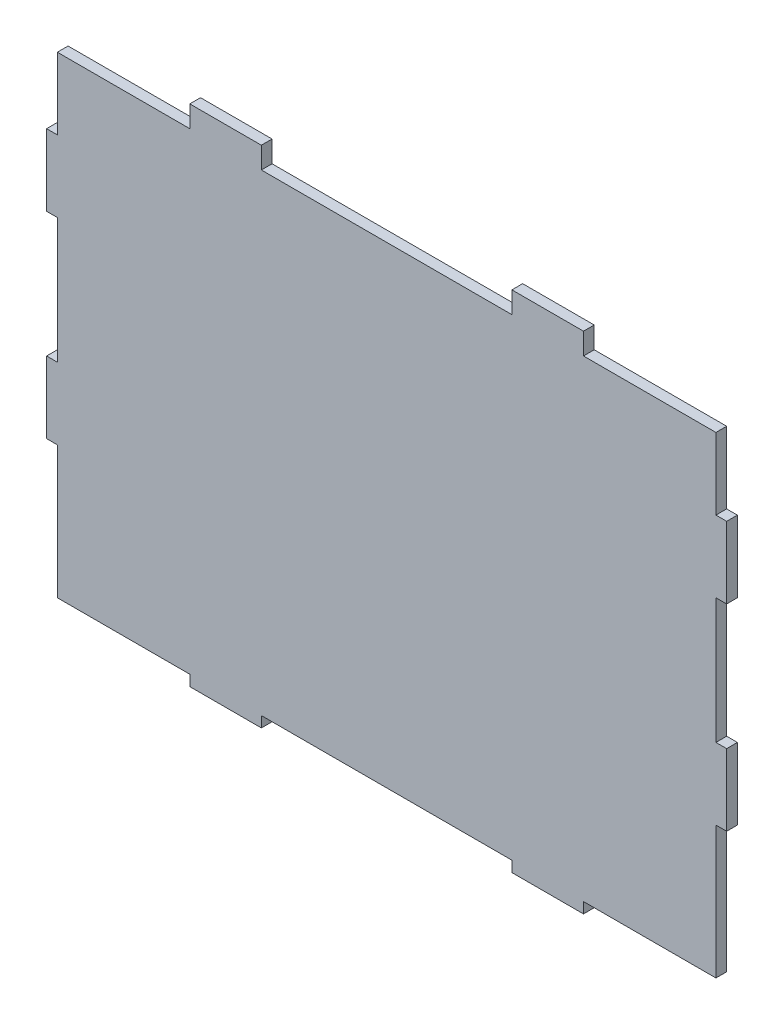
ISO-10303-21;
HEADER;
FILE_DESCRIPTION(('STEP AP214'),'2;1');
FILE_NAME('part.step','',(''),(''),'','','');
FILE_SCHEMA(('AUTOMOTIVE_DESIGN { 1 0 10303 214 1 1 1 1 }'));
ENDSEC;
DATA;
#1=APPLICATION_CONTEXT('core data for automotive mechanical design processes');
#2=APPLICATION_PROTOCOL_DEFINITION('international standard','automotive_design',2000,#1);
#3=PRODUCT_CONTEXT('',#1,'mechanical');
#4=PRODUCT('Part','Part','',(#3));
#5=PRODUCT_RELATED_PRODUCT_CATEGORY('part','',(#4));
#6=PRODUCT_DEFINITION_FORMATION('','',#4);
#7=PRODUCT_DEFINITION_CONTEXT('part definition',#1,'design');
#8=PRODUCT_DEFINITION('design','',#6,#7);
#9=PRODUCT_DEFINITION_SHAPE('','',#8);
#10=(LENGTH_UNIT() NAMED_UNIT(*) SI_UNIT(.MILLI.,.METRE.));
#11=(NAMED_UNIT(*) PLANE_ANGLE_UNIT() SI_UNIT($,.RADIAN.));
#12=(NAMED_UNIT(*) SI_UNIT($,.STERADIAN.) SOLID_ANGLE_UNIT());
#13=UNCERTAINTY_MEASURE_WITH_UNIT(LENGTH_MEASURE(1.E-05),#10,'distance_accuracy_value','');
#14=(GEOMETRIC_REPRESENTATION_CONTEXT(3) GLOBAL_UNCERTAINTY_ASSIGNED_CONTEXT((#13)) GLOBAL_UNIT_ASSIGNED_CONTEXT((#10,
#11,#12)) REPRESENTATION_CONTEXT('',''));
#15=CARTESIAN_POINT('',(0.,0.,0.));
#16=DIRECTION('',(0.,0.,1.));
#17=DIRECTION('',(1.,0.,0.));
#18=AXIS2_PLACEMENT_3D('',#15,#16,#17);
#19=CARTESIAN_POINT('',(0.,0.,3.));
#20=DIRECTION('',(1.,0.,0.));
#21=DIRECTION('',(0.,1.,0.));
#22=AXIS2_PLACEMENT_3D('',#19,#20,#21);
#23=PLANE('',#22);
#24=DIRECTION('',(0.,-1.,0.));
#25=VECTOR('',#24,1.);
#26=CARTESIAN_POINT('',(0.,0.,0.));
#27=LINE('',#26,#25);
#28=CARTESIAN_POINT('',(0.,37.,0.));
#29=VERTEX_POINT('',#28);
#30=CARTESIAN_POINT('',(0.,0.,0.));
#31=VERTEX_POINT('',#30);
#32=EDGE_CURVE('E308',#29,#31,#27,.T.);
#33=ORIENTED_EDGE('',*,*,#32,.T.);
#34=DIRECTION('',(0.,0.,-1.));
#35=VECTOR('',#34,1.);
#36=CARTESIAN_POINT('',(0.,0.,3.));
#37=LINE('',#36,#35);
#38=CARTESIAN_POINT('',(0.,0.,3.));
#39=VERTEX_POINT('',#38);
#40=EDGE_CURVE('E11',#39,#31,#37,.T.);
#41=ORIENTED_EDGE('',*,*,#40,.F.);
#42=DIRECTION('',(0.,-1.,0.));
#43=VECTOR('',#42,1.);
#44=CARTESIAN_POINT('',(0.,0.,3.));
#45=LINE('',#44,#43);
#46=CARTESIAN_POINT('',(0.,37.,3.));
#47=VERTEX_POINT('',#46);
#48=EDGE_CURVE('E414',#47,#39,#45,.T.);
#49=ORIENTED_EDGE('',*,*,#48,.F.);
#50=DIRECTION('',(0.,0.,-1.));
#51=VECTOR('',#50,1.);
#52=CARTESIAN_POINT('',(0.,37.,3.));
#53=LINE('',#52,#51);
#54=EDGE_CURVE('E304',#47,#29,#53,.T.);
#55=ORIENTED_EDGE('',*,*,#54,.T.);
#56=EDGE_LOOP('',(#33,#41,#49,#55));
#57=FACE_BOUND('',#56,.T.);
#58=ADVANCED_FACE('F39',(#57),#23,.F.);
#59=CARTESIAN_POINT('',(0.,0.,3.));
#60=DIRECTION('',(0.,1.,0.));
#61=DIRECTION('',(0.,0.,1.));
#62=AXIS2_PLACEMENT_3D('',#59,#60,#61);
#63=PLANE('',#62);
#64=DIRECTION('',(1.,0.,0.));
#65=VECTOR('',#64,1.);
#66=CARTESIAN_POINT('',(0.,0.,0.));
#67=LINE('',#66,#65);
#68=CARTESIAN_POINT('',(37.,0.,0.));
#69=VERTEX_POINT('',#68);
#70=EDGE_CURVE('E312',#31,#69,#67,.T.);
#71=ORIENTED_EDGE('',*,*,#70,.T.);
#72=DIRECTION('',(0.,0.,-1.));
#73=VECTOR('',#72,1.);
#74=CARTESIAN_POINT('',(37.,0.,3.));
#75=LINE('',#74,#73);
#76=CARTESIAN_POINT('',(37.,0.,3.));
#77=VERTEX_POINT('',#76);
#78=EDGE_CURVE('E48',#77,#69,#75,.T.);
#79=ORIENTED_EDGE('',*,*,#78,.F.);
#80=DIRECTION('',(1.,0.,0.));
#81=VECTOR('',#80,1.);
#82=CARTESIAN_POINT('',(0.,0.,3.));
#83=LINE('',#82,#81);
#84=EDGE_CURVE('E183',#39,#77,#83,.T.);
#85=ORIENTED_EDGE('',*,*,#84,.F.);
#86=ORIENTED_EDGE('',*,*,#40,.T.);
#87=EDGE_LOOP('',(#71,#79,#85,#86));
#88=FACE_BOUND('',#87,.T.);
#89=ADVANCED_FACE('F676',(#88),#63,.F.);
#90=CARTESIAN_POINT('',(37.,0.,3.));
#91=DIRECTION('',(1.,0.,0.));
#92=DIRECTION('',(0.,0.,-1.));
#93=AXIS2_PLACEMENT_3D('',#90,#91,#92);
#94=PLANE('',#93);
#95=DIRECTION('',(0.,-1.,0.));
#96=VECTOR('',#95,1.);
#97=CARTESIAN_POINT('',(37.,0.,0.));
#98=LINE('',#97,#96);
#99=CARTESIAN_POINT('',(37.,-3.,0.));
#100=VERTEX_POINT('',#99);
#101=EDGE_CURVE('E315',#69,#100,#98,.T.);
#102=ORIENTED_EDGE('',*,*,#101,.T.);
#103=DIRECTION('',(0.,0.,-1.));
#104=VECTOR('',#103,1.);
#105=CARTESIAN_POINT('',(37.,-3.,3.));
#106=LINE('',#105,#104);
#107=CARTESIAN_POINT('',(37.,-3.,3.));
#108=VERTEX_POINT('',#107);
#109=EDGE_CURVE('E537',#108,#100,#106,.T.);
#110=ORIENTED_EDGE('',*,*,#109,.F.);
#111=DIRECTION('',(0.,-1.,0.));
#112=VECTOR('',#111,1.);
#113=CARTESIAN_POINT('',(37.,0.,3.));
#114=LINE('',#113,#112);
#115=EDGE_CURVE('E547',#77,#108,#114,.T.);
#116=ORIENTED_EDGE('',*,*,#115,.F.);
#117=ORIENTED_EDGE('',*,*,#78,.T.);
#118=EDGE_LOOP('',(#102,#110,#116,#117));
#119=FACE_BOUND('',#118,.T.);
#120=ADVANCED_FACE('F545',(#119),#94,.F.);
#121=CARTESIAN_POINT('',(57.,-3.,3.));
#122=DIRECTION('',(0.,1.,0.));
#123=DIRECTION('',(-1.,0.,0.));
#124=AXIS2_PLACEMENT_3D('',#121,#122,#123);
#125=PLANE('',#124);
#126=DIRECTION('',(1.,0.,0.));
#127=VECTOR('',#126,1.);
#128=CARTESIAN_POINT('',(57.,-3.,0.));
#129=LINE('',#128,#127);
#130=CARTESIAN_POINT('',(57.,-3.,0.));
#131=VERTEX_POINT('',#130);
#132=EDGE_CURVE('E318',#100,#131,#129,.T.);
#133=ORIENTED_EDGE('',*,*,#132,.T.);
#134=DIRECTION('',(0.,0.,-1.));
#135=VECTOR('',#134,1.);
#136=CARTESIAN_POINT('',(57.,-3.,3.));
#137=LINE('',#136,#135);
#138=CARTESIAN_POINT('',(57.,-3.,3.));
#139=VERTEX_POINT('',#138);
#140=EDGE_CURVE('E533',#139,#131,#137,.T.);
#141=ORIENTED_EDGE('',*,*,#140,.F.);
#142=DIRECTION('',(1.,0.,0.));
#143=VECTOR('',#142,1.);
#144=CARTESIAN_POINT('',(57.,-3.,3.));
#145=LINE('',#144,#143);
#146=EDGE_CURVE('E566',#108,#139,#145,.T.);
#147=ORIENTED_EDGE('',*,*,#146,.F.);
#148=ORIENTED_EDGE('',*,*,#109,.T.);
#149=EDGE_LOOP('',(#133,#141,#147,#148));
#150=FACE_BOUND('',#149,.T.);
#151=ADVANCED_FACE('F556',(#150),#125,.F.);
#152=CARTESIAN_POINT('',(57.,0.,3.));
#153=DIRECTION('',(-1.,0.,0.));
#154=DIRECTION('',(0.,0.,1.));
#155=AXIS2_PLACEMENT_3D('',#152,#153,#154);
#156=PLANE('',#155);
#157=DIRECTION('',(0.,1.,0.));
#158=VECTOR('',#157,1.);
#159=CARTESIAN_POINT('',(57.,0.,0.));
#160=LINE('',#159,#158);
#161=CARTESIAN_POINT('',(57.,0.,0.));
#162=VERTEX_POINT('',#161);
#163=EDGE_CURVE('E321',#131,#162,#160,.T.);
#164=ORIENTED_EDGE('',*,*,#163,.T.);
#165=DIRECTION('',(0.,0.,-1.));
#166=VECTOR('',#165,1.);
#167=CARTESIAN_POINT('',(57.,0.,3.));
#168=LINE('',#167,#166);
#169=CARTESIAN_POINT('',(57.,0.,3.));
#170=VERTEX_POINT('',#169);
#171=EDGE_CURVE('E529',#170,#162,#168,.T.);
#172=ORIENTED_EDGE('',*,*,#171,.F.);
#173=DIRECTION('',(0.,1.,0.));
#174=VECTOR('',#173,1.);
#175=CARTESIAN_POINT('',(57.,0.,3.));
#176=LINE('',#175,#174);
#177=EDGE_CURVE('E562',#139,#170,#176,.T.);
#178=ORIENTED_EDGE('',*,*,#177,.F.);
#179=ORIENTED_EDGE('',*,*,#140,.T.);
#180=EDGE_LOOP('',(#164,#172,#178,#179));
#181=FACE_BOUND('',#180,.T.);
#182=ADVANCED_FACE('F560',(#181),#156,.F.);
#183=CARTESIAN_POINT('',(57.,0.,3.));
#184=DIRECTION('',(0.,1.,0.));
#185=DIRECTION('',(-1.,0.,0.));
#186=AXIS2_PLACEMENT_3D('',#183,#184,#185);
#187=PLANE('',#186);
#188=DIRECTION('',(1.,0.,0.));
#189=VECTOR('',#188,1.);
#190=CARTESIAN_POINT('',(57.,0.,0.));
#191=LINE('',#190,#189);
#192=CARTESIAN_POINT('',(127.,0.,0.));
#193=VERTEX_POINT('',#192);
#194=EDGE_CURVE('E324',#162,#193,#191,.T.);
#195=ORIENTED_EDGE('',*,*,#194,.T.);
#196=DIRECTION('',(0.,0.,-1.));
#197=VECTOR('',#196,1.);
#198=CARTESIAN_POINT('',(127.,0.,3.));
#199=LINE('',#198,#197);
#200=CARTESIAN_POINT('',(127.,0.,3.));
#201=VERTEX_POINT('',#200);
#202=EDGE_CURVE('E525',#201,#193,#199,.T.);
#203=ORIENTED_EDGE('',*,*,#202,.F.);
#204=DIRECTION('',(1.,0.,0.));
#205=VECTOR('',#204,1.);
#206=CARTESIAN_POINT('',(57.,0.,3.));
#207=LINE('',#206,#205);
#208=EDGE_CURVE('E565',#170,#201,#207,.T.);
#209=ORIENTED_EDGE('',*,*,#208,.F.);
#210=ORIENTED_EDGE('',*,*,#171,.T.);
#211=EDGE_LOOP('',(#195,#203,#209,#210));
#212=FACE_BOUND('',#211,.T.);
#213=ADVANCED_FACE('F689',(#212),#187,.F.);
#214=CARTESIAN_POINT('',(127.,0.,3.));
#215=DIRECTION('',(1.,0.,0.));
#216=DIRECTION('',(0.,0.,-1.));
#217=AXIS2_PLACEMENT_3D('',#214,#215,#216);
#218=PLANE('',#217);
#219=DIRECTION('',(0.,-1.,0.));
#220=VECTOR('',#219,1.);
#221=CARTESIAN_POINT('',(127.,0.,0.));
#222=LINE('',#221,#220);
#223=CARTESIAN_POINT('',(127.,-2.99999999999999,0.));
#224=VERTEX_POINT('',#223);
#225=EDGE_CURVE('E327',#193,#224,#222,.T.);
#226=ORIENTED_EDGE('',*,*,#225,.T.);
#227=DIRECTION('',(0.,0.,-1.));
#228=VECTOR('',#227,1.);
#229=CARTESIAN_POINT('',(127.,-2.99999999999999,3.));
#230=LINE('',#229,#228);
#231=CARTESIAN_POINT('',(127.,-2.99999999999999,3.));
#232=VERTEX_POINT('',#231);
#233=EDGE_CURVE('E521',#232,#224,#230,.T.);
#234=ORIENTED_EDGE('',*,*,#233,.F.);
#235=DIRECTION('',(0.,-1.,0.));
#236=VECTOR('',#235,1.);
#237=CARTESIAN_POINT('',(127.,0.,3.));
#238=LINE('',#237,#236);
#239=EDGE_CURVE('E570',#201,#232,#238,.T.);
#240=ORIENTED_EDGE('',*,*,#239,.F.);
#241=ORIENTED_EDGE('',*,*,#202,.T.);
#242=EDGE_LOOP('',(#226,#234,#240,#241));
#243=FACE_BOUND('',#242,.T.);
#244=ADVANCED_FACE('F692',(#243),#218,.F.);
#245=CARTESIAN_POINT('',(147.,-2.99999999999999,3.));
#246=DIRECTION('',(0.,1.,0.));
#247=DIRECTION('',(-1.,0.,0.));
#248=AXIS2_PLACEMENT_3D('',#245,#246,#247);
#249=PLANE('',#248);
#250=DIRECTION('',(1.,0.,0.));
#251=VECTOR('',#250,1.);
#252=CARTESIAN_POINT('',(147.,-2.99999999999999,0.));
#253=LINE('',#252,#251);
#254=CARTESIAN_POINT('',(147.,-2.99999999999999,0.));
#255=VERTEX_POINT('',#254);
#256=EDGE_CURVE('E330',#224,#255,#253,.T.);
#257=ORIENTED_EDGE('',*,*,#256,.T.);
#258=DIRECTION('',(0.,0.,-1.));
#259=VECTOR('',#258,1.);
#260=CARTESIAN_POINT('',(147.,-2.99999999999999,3.));
#261=LINE('',#260,#259);
#262=CARTESIAN_POINT('',(147.,-2.99999999999999,3.));
#263=VERTEX_POINT('',#262);
#264=EDGE_CURVE('E517',#263,#255,#261,.T.);
#265=ORIENTED_EDGE('',*,*,#264,.F.);
#266=DIRECTION('',(1.,0.,0.));
#267=VECTOR('',#266,1.);
#268=CARTESIAN_POINT('',(147.,-2.99999999999999,3.));
#269=LINE('',#268,#267);
#270=EDGE_CURVE('E577',#232,#263,#269,.T.);
#271=ORIENTED_EDGE('',*,*,#270,.F.);
#272=ORIENTED_EDGE('',*,*,#233,.T.);
#273=EDGE_LOOP('',(#257,#265,#271,#272));
#274=FACE_BOUND('',#273,.T.);
#275=ADVANCED_FACE('F696',(#274),#249,.F.);
#276=CARTESIAN_POINT('',(147.,0.,3.));
#277=DIRECTION('',(-1.,0.,0.));
#278=DIRECTION('',(0.,0.,1.));
#279=AXIS2_PLACEMENT_3D('',#276,#277,#278);
#280=PLANE('',#279);
#281=DIRECTION('',(0.,1.,0.));
#282=VECTOR('',#281,1.);
#283=CARTESIAN_POINT('',(147.,0.,0.));
#284=LINE('',#283,#282);
#285=CARTESIAN_POINT('',(147.,0.,0.));
#286=VERTEX_POINT('',#285);
#287=EDGE_CURVE('E333',#255,#286,#284,.T.);
#288=ORIENTED_EDGE('',*,*,#287,.T.);
#289=DIRECTION('',(0.,0.,-1.));
#290=VECTOR('',#289,1.);
#291=CARTESIAN_POINT('',(147.,0.,3.));
#292=LINE('',#291,#290);
#293=CARTESIAN_POINT('',(147.,0.,3.));
#294=VERTEX_POINT('',#293);
#295=EDGE_CURVE('E513',#294,#286,#292,.T.);
#296=ORIENTED_EDGE('',*,*,#295,.F.);
#297=DIRECTION('',(0.,1.,0.));
#298=VECTOR('',#297,1.);
#299=CARTESIAN_POINT('',(147.,0.,3.));
#300=LINE('',#299,#298);
#301=EDGE_CURVE('E580',#263,#294,#300,.T.);
#302=ORIENTED_EDGE('',*,*,#301,.F.);
#303=ORIENTED_EDGE('',*,*,#264,.T.);
#304=EDGE_LOOP('',(#288,#296,#302,#303));
#305=FACE_BOUND('',#304,.T.);
#306=ADVANCED_FACE('F700',(#305),#280,.F.);
#307=CARTESIAN_POINT('',(147.,0.,3.));
#308=DIRECTION('',(0.,1.,0.));
#309=DIRECTION('',(0.,0.,1.));
#310=AXIS2_PLACEMENT_3D('',#307,#308,#309);
#311=PLANE('',#310);
#312=DIRECTION('',(1.,0.,0.));
#313=VECTOR('',#312,1.);
#314=CARTESIAN_POINT('',(147.,0.,0.));
#315=LINE('',#314,#313);
#316=CARTESIAN_POINT('',(184.,0.,0.));
#317=VERTEX_POINT('',#316);
#318=EDGE_CURVE('E336',#286,#317,#315,.T.);
#319=ORIENTED_EDGE('',*,*,#318,.T.);
#320=DIRECTION('',(0.,0.,-1.));
#321=VECTOR('',#320,1.);
#322=CARTESIAN_POINT('',(184.,0.,3.));
#323=LINE('',#322,#321);
#324=CARTESIAN_POINT('',(184.,0.,3.));
#325=VERTEX_POINT('',#324);
#326=EDGE_CURVE('E509',#325,#317,#323,.T.);
#327=ORIENTED_EDGE('',*,*,#326,.F.);
#328=DIRECTION('',(1.,0.,0.));
#329=VECTOR('',#328,1.);
#330=CARTESIAN_POINT('',(147.,0.,3.));
#331=LINE('',#330,#329);
#332=EDGE_CURVE('E583',#294,#325,#331,.T.);
#333=ORIENTED_EDGE('',*,*,#332,.F.);
#334=ORIENTED_EDGE('',*,*,#295,.T.);
#335=EDGE_LOOP('',(#319,#327,#333,#334));
#336=FACE_BOUND('',#335,.T.);
#337=ADVANCED_FACE('F704',(#336),#311,.F.);
#338=CARTESIAN_POINT('',(184.,0.,3.));
#339=DIRECTION('',(-1.,0.,0.));
#340=DIRECTION('',(0.,0.,1.));
#341=AXIS2_PLACEMENT_3D('',#338,#339,#340);
#342=PLANE('',#341);
#343=DIRECTION('',(0.,1.,0.));
#344=VECTOR('',#343,1.);
#345=CARTESIAN_POINT('',(184.,0.,0.));
#346=LINE('',#345,#344);
#347=CARTESIAN_POINT('',(184.,37.,0.));
#348=VERTEX_POINT('',#347);
#349=EDGE_CURVE('E339',#317,#348,#346,.T.);
#350=ORIENTED_EDGE('',*,*,#349,.T.);
#351=DIRECTION('',(0.,0.,-1.));
#352=VECTOR('',#351,1.);
#353=CARTESIAN_POINT('',(184.,37.,3.));
#354=LINE('',#353,#352);
#355=CARTESIAN_POINT('',(184.,37.,3.));
#356=VERTEX_POINT('',#355);
#357=EDGE_CURVE('E505',#356,#348,#354,.T.);
#358=ORIENTED_EDGE('',*,*,#357,.F.);
#359=DIRECTION('',(0.,1.,0.));
#360=VECTOR('',#359,1.);
#361=CARTESIAN_POINT('',(184.,0.,3.));
#362=LINE('',#361,#360);
#363=EDGE_CURVE('E586',#325,#356,#362,.T.);
#364=ORIENTED_EDGE('',*,*,#363,.F.);
#365=ORIENTED_EDGE('',*,*,#326,.T.);
#366=EDGE_LOOP('',(#350,#358,#364,#365));
#367=FACE_BOUND('',#366,.T.);
#368=ADVANCED_FACE('F708',(#367),#342,.F.);
#369=CARTESIAN_POINT('',(184.,37.,3.));
#370=DIRECTION('',(0.,1.,0.));
#371=DIRECTION('',(0.,0.,1.));
#372=AXIS2_PLACEMENT_3D('',#369,#370,#371);
#373=PLANE('',#372);
#374=DIRECTION('',(1.,0.,0.));
#375=VECTOR('',#374,1.);
#376=CARTESIAN_POINT('',(184.,37.,0.));
#377=LINE('',#376,#375);
#378=CARTESIAN_POINT('',(187.,37.,0.));
#379=VERTEX_POINT('',#378);
#380=EDGE_CURVE('E342',#348,#379,#377,.T.);
#381=ORIENTED_EDGE('',*,*,#380,.T.);
#382=DIRECTION('',(0.,0.,-1.));
#383=VECTOR('',#382,1.);
#384=CARTESIAN_POINT('',(187.,37.,3.));
#385=LINE('',#384,#383);
#386=CARTESIAN_POINT('',(187.,37.,3.));
#387=VERTEX_POINT('',#386);
#388=EDGE_CURVE('E501',#387,#379,#385,.T.);
#389=ORIENTED_EDGE('',*,*,#388,.F.);
#390=DIRECTION('',(1.,0.,0.));
#391=VECTOR('',#390,1.);
#392=CARTESIAN_POINT('',(184.,37.,3.));
#393=LINE('',#392,#391);
#394=EDGE_CURVE('E589',#356,#387,#393,.T.);
#395=ORIENTED_EDGE('',*,*,#394,.F.);
#396=ORIENTED_EDGE('',*,*,#357,.T.);
#397=EDGE_LOOP('',(#381,#389,#395,#396));
#398=FACE_BOUND('',#397,.T.);
#399=ADVANCED_FACE('F712',(#398),#373,.F.);
#400=CARTESIAN_POINT('',(187.,57.,3.));
#401=DIRECTION('',(-1.,0.,0.));
#402=DIRECTION('',(0.,0.,1.));
#403=AXIS2_PLACEMENT_3D('',#400,#401,#402);
#404=PLANE('',#403);
#405=DIRECTION('',(0.,1.,0.));
#406=VECTOR('',#405,1.);
#407=CARTESIAN_POINT('',(187.,57.,0.));
#408=LINE('',#407,#406);
#409=CARTESIAN_POINT('',(187.,57.,0.));
#410=VERTEX_POINT('',#409);
#411=EDGE_CURVE('E345',#379,#410,#408,.T.);
#412=ORIENTED_EDGE('',*,*,#411,.T.);
#413=DIRECTION('',(0.,0.,-1.));
#414=VECTOR('',#413,1.);
#415=CARTESIAN_POINT('',(187.,57.,3.));
#416=LINE('',#415,#414);
#417=CARTESIAN_POINT('',(187.,57.,3.));
#418=VERTEX_POINT('',#417);
#419=EDGE_CURVE('E497',#418,#410,#416,.T.);
#420=ORIENTED_EDGE('',*,*,#419,.F.);
#421=DIRECTION('',(0.,1.,0.));
#422=VECTOR('',#421,1.);
#423=CARTESIAN_POINT('',(187.,57.,3.));
#424=LINE('',#423,#422);
#425=EDGE_CURVE('E592',#387,#418,#424,.T.);
#426=ORIENTED_EDGE('',*,*,#425,.F.);
#427=ORIENTED_EDGE('',*,*,#388,.T.);
#428=EDGE_LOOP('',(#412,#420,#426,#427));
#429=FACE_BOUND('',#428,.T.);
#430=ADVANCED_FACE('F716',(#429),#404,.F.);
#431=CARTESIAN_POINT('',(184.,57.,3.));
#432=DIRECTION('',(0.,-1.,0.));
#433=DIRECTION('',(1.,0.,0.));
#434=AXIS2_PLACEMENT_3D('',#431,#432,#433);
#435=PLANE('',#434);
#436=DIRECTION('',(-1.,0.,0.));
#437=VECTOR('',#436,1.);
#438=CARTESIAN_POINT('',(184.,57.,0.));
#439=LINE('',#438,#437);
#440=CARTESIAN_POINT('',(184.,57.,0.));
#441=VERTEX_POINT('',#440);
#442=EDGE_CURVE('E348',#410,#441,#439,.T.);
#443=ORIENTED_EDGE('',*,*,#442,.T.);
#444=DIRECTION('',(0.,0.,-1.));
#445=VECTOR('',#444,1.);
#446=CARTESIAN_POINT('',(184.,57.,3.));
#447=LINE('',#446,#445);
#448=CARTESIAN_POINT('',(184.,57.,3.));
#449=VERTEX_POINT('',#448);
#450=EDGE_CURVE('E493',#449,#441,#447,.T.);
#451=ORIENTED_EDGE('',*,*,#450,.F.);
#452=DIRECTION('',(-1.,0.,0.));
#453=VECTOR('',#452,1.);
#454=CARTESIAN_POINT('',(184.,57.,3.));
#455=LINE('',#454,#453);
#456=EDGE_CURVE('E595',#418,#449,#455,.T.);
#457=ORIENTED_EDGE('',*,*,#456,.F.);
#458=ORIENTED_EDGE('',*,*,#419,.T.);
#459=EDGE_LOOP('',(#443,#451,#457,#458));
#460=FACE_BOUND('',#459,.T.);
#461=ADVANCED_FACE('F720',(#460),#435,.F.);
#462=CARTESIAN_POINT('',(184.,57.,3.));
#463=DIRECTION('',(-1.,0.,0.));
#464=DIRECTION('',(0.,0.,1.));
#465=AXIS2_PLACEMENT_3D('',#462,#463,#464);
#466=PLANE('',#465);
#467=DIRECTION('',(0.,1.,0.));
#468=VECTOR('',#467,1.);
#469=CARTESIAN_POINT('',(184.,57.,0.));
#470=LINE('',#469,#468);
#471=CARTESIAN_POINT('',(184.,92.,0.));
#472=VERTEX_POINT('',#471);
#473=EDGE_CURVE('E351',#441,#472,#470,.T.);
#474=ORIENTED_EDGE('',*,*,#473,.T.);
#475=DIRECTION('',(0.,0.,-1.));
#476=VECTOR('',#475,1.);
#477=CARTESIAN_POINT('',(184.,92.,3.));
#478=LINE('',#477,#476);
#479=CARTESIAN_POINT('',(184.,92.,3.));
#480=VERTEX_POINT('',#479);
#481=EDGE_CURVE('E489',#480,#472,#478,.T.);
#482=ORIENTED_EDGE('',*,*,#481,.F.);
#483=DIRECTION('',(0.,1.,0.));
#484=VECTOR('',#483,1.);
#485=CARTESIAN_POINT('',(184.,57.,3.));
#486=LINE('',#485,#484);
#487=EDGE_CURVE('E598',#449,#480,#486,.T.);
#488=ORIENTED_EDGE('',*,*,#487,.F.);
#489=ORIENTED_EDGE('',*,*,#450,.T.);
#490=EDGE_LOOP('',(#474,#482,#488,#489));
#491=FACE_BOUND('',#490,.T.);
#492=ADVANCED_FACE('F724',(#491),#466,.F.);
#493=CARTESIAN_POINT('',(184.,92.,3.));
#494=DIRECTION('',(0.,1.,0.));
#495=DIRECTION('',(-1.,0.,0.));
#496=AXIS2_PLACEMENT_3D('',#493,#494,#495);
#497=PLANE('',#496);
#498=DIRECTION('',(1.,0.,0.));
#499=VECTOR('',#498,1.);
#500=CARTESIAN_POINT('',(184.,92.,0.));
#501=LINE('',#500,#499);
#502=CARTESIAN_POINT('',(187.,92.,0.));
#503=VERTEX_POINT('',#502);
#504=EDGE_CURVE('E354',#472,#503,#501,.T.);
#505=ORIENTED_EDGE('',*,*,#504,.T.);
#506=DIRECTION('',(0.,0.,-1.));
#507=VECTOR('',#506,1.);
#508=CARTESIAN_POINT('',(187.,92.,3.));
#509=LINE('',#508,#507);
#510=CARTESIAN_POINT('',(187.,92.,3.));
#511=VERTEX_POINT('',#510);
#512=EDGE_CURVE('E485',#511,#503,#509,.T.);
#513=ORIENTED_EDGE('',*,*,#512,.F.);
#514=DIRECTION('',(1.,0.,0.));
#515=VECTOR('',#514,1.);
#516=CARTESIAN_POINT('',(184.,92.,3.));
#517=LINE('',#516,#515);
#518=EDGE_CURVE('E601',#480,#511,#517,.T.);
#519=ORIENTED_EDGE('',*,*,#518,.F.);
#520=ORIENTED_EDGE('',*,*,#481,.T.);
#521=EDGE_LOOP('',(#505,#513,#519,#520));
#522=FACE_BOUND('',#521,.T.);
#523=ADVANCED_FACE('F728',(#522),#497,.F.);
#524=CARTESIAN_POINT('',(187.,112.,3.));
#525=DIRECTION('',(-1.,0.,0.));
#526=DIRECTION('',(0.,0.,1.));
#527=AXIS2_PLACEMENT_3D('',#524,#525,#526);
#528=PLANE('',#527);
#529=DIRECTION('',(0.,1.,0.));
#530=VECTOR('',#529,1.);
#531=CARTESIAN_POINT('',(187.,112.,0.));
#532=LINE('',#531,#530);
#533=CARTESIAN_POINT('',(187.,112.,0.));
#534=VERTEX_POINT('',#533);
#535=EDGE_CURVE('E357',#503,#534,#532,.T.);
#536=ORIENTED_EDGE('',*,*,#535,.T.);
#537=DIRECTION('',(0.,0.,-1.));
#538=VECTOR('',#537,1.);
#539=CARTESIAN_POINT('',(187.,112.,3.));
#540=LINE('',#539,#538);
#541=CARTESIAN_POINT('',(187.,112.,3.));
#542=VERTEX_POINT('',#541);
#543=EDGE_CURVE('E481',#542,#534,#540,.T.);
#544=ORIENTED_EDGE('',*,*,#543,.F.);
#545=DIRECTION('',(0.,1.,0.));
#546=VECTOR('',#545,1.);
#547=CARTESIAN_POINT('',(187.,112.,3.));
#548=LINE('',#547,#546);
#549=EDGE_CURVE('E604',#511,#542,#548,.T.);
#550=ORIENTED_EDGE('',*,*,#549,.F.);
#551=ORIENTED_EDGE('',*,*,#512,.T.);
#552=EDGE_LOOP('',(#536,#544,#550,#551));
#553=FACE_BOUND('',#552,.T.);
#554=ADVANCED_FACE('F732',(#553),#528,.F.);
#555=CARTESIAN_POINT('',(184.,112.,3.));
#556=DIRECTION('',(0.,-1.,0.));
#557=DIRECTION('',(1.,0.,0.));
#558=AXIS2_PLACEMENT_3D('',#555,#556,#557);
#559=PLANE('',#558);
#560=DIRECTION('',(-1.,0.,0.));
#561=VECTOR('',#560,1.);
#562=CARTESIAN_POINT('',(184.,112.,0.));
#563=LINE('',#562,#561);
#564=CARTESIAN_POINT('',(184.,112.,0.));
#565=VERTEX_POINT('',#564);
#566=EDGE_CURVE('E360',#534,#565,#563,.T.);
#567=ORIENTED_EDGE('',*,*,#566,.T.);
#568=DIRECTION('',(0.,0.,-1.));
#569=VECTOR('',#568,1.);
#570=CARTESIAN_POINT('',(184.,112.,3.));
#571=LINE('',#570,#569);
#572=CARTESIAN_POINT('',(184.,112.,3.));
#573=VERTEX_POINT('',#572);
#574=EDGE_CURVE('E477',#573,#565,#571,.T.);
#575=ORIENTED_EDGE('',*,*,#574,.F.);
#576=DIRECTION('',(-1.,0.,0.));
#577=VECTOR('',#576,1.);
#578=CARTESIAN_POINT('',(184.,112.,3.));
#579=LINE('',#578,#577);
#580=EDGE_CURVE('E607',#542,#573,#579,.T.);
#581=ORIENTED_EDGE('',*,*,#580,.F.);
#582=ORIENTED_EDGE('',*,*,#543,.T.);
#583=EDGE_LOOP('',(#567,#575,#581,#582));
#584=FACE_BOUND('',#583,.T.);
#585=ADVANCED_FACE('F736',(#584),#559,.F.);
#586=CARTESIAN_POINT('',(184.,112.,3.));
#587=DIRECTION('',(-1.,0.,0.));
#588=DIRECTION('',(0.,0.,1.));
#589=AXIS2_PLACEMENT_3D('',#586,#587,#588);
#590=PLANE('',#589);
#591=DIRECTION('',(0.,1.,0.));
#592=VECTOR('',#591,1.);
#593=CARTESIAN_POINT('',(184.,112.,0.));
#594=LINE('',#593,#592);
#595=CARTESIAN_POINT('',(184.,132.,0.));
#596=VERTEX_POINT('',#595);
#597=EDGE_CURVE('E363',#565,#596,#594,.T.);
#598=ORIENTED_EDGE('',*,*,#597,.T.);
#599=DIRECTION('',(0.,0.,-1.));
#600=VECTOR('',#599,1.);
#601=CARTESIAN_POINT('',(184.,132.,3.));
#602=LINE('',#601,#600);
#603=CARTESIAN_POINT('',(184.,132.,3.));
#604=VERTEX_POINT('',#603);
#605=EDGE_CURVE('E473',#604,#596,#602,.T.);
#606=ORIENTED_EDGE('',*,*,#605,.F.);
#607=DIRECTION('',(0.,1.,0.));
#608=VECTOR('',#607,1.);
#609=CARTESIAN_POINT('',(184.,112.,3.));
#610=LINE('',#609,#608);
#611=EDGE_CURVE('E610',#573,#604,#610,.T.);
#612=ORIENTED_EDGE('',*,*,#611,.F.);
#613=ORIENTED_EDGE('',*,*,#574,.T.);
#614=EDGE_LOOP('',(#598,#606,#612,#613));
#615=FACE_BOUND('',#614,.T.);
#616=ADVANCED_FACE('F740',(#615),#590,.F.);
#617=CARTESIAN_POINT('',(147.,132.,3.));
#618=DIRECTION('',(0.,-1.,0.));
#619=DIRECTION('',(0.,0.,-1.));
#620=AXIS2_PLACEMENT_3D('',#617,#618,#619);
#621=PLANE('',#620);
#622=DIRECTION('',(-1.,0.,0.));
#623=VECTOR('',#622,1.);
#624=CARTESIAN_POINT('',(147.,132.,0.));
#625=LINE('',#624,#623);
#626=CARTESIAN_POINT('',(147.,132.,0.));
#627=VERTEX_POINT('',#626);
#628=EDGE_CURVE('E366',#596,#627,#625,.T.);
#629=ORIENTED_EDGE('',*,*,#628,.T.);
#630=DIRECTION('',(0.,0.,-1.));
#631=VECTOR('',#630,1.);
#632=CARTESIAN_POINT('',(147.,132.,3.));
#633=LINE('',#632,#631);
#634=CARTESIAN_POINT('',(147.,132.,3.));
#635=VERTEX_POINT('',#634);
#636=EDGE_CURVE('E469',#635,#627,#633,.T.);
#637=ORIENTED_EDGE('',*,*,#636,.F.);
#638=DIRECTION('',(-1.,0.,0.));
#639=VECTOR('',#638,1.);
#640=CARTESIAN_POINT('',(147.,132.,3.));
#641=LINE('',#640,#639);
#642=EDGE_CURVE('E613',#604,#635,#641,.T.);
#643=ORIENTED_EDGE('',*,*,#642,.F.);
#644=ORIENTED_EDGE('',*,*,#605,.T.);
#645=EDGE_LOOP('',(#629,#637,#643,#644));
#646=FACE_BOUND('',#645,.T.);
#647=ADVANCED_FACE('F744',(#646),#621,.F.);
#648=CARTESIAN_POINT('',(147.,132.,3.));
#649=DIRECTION('',(-1.,0.,0.));
#650=DIRECTION('',(0.,0.,1.));
#651=AXIS2_PLACEMENT_3D('',#648,#649,#650);
#652=PLANE('',#651);
#653=DIRECTION('',(0.,1.,0.));
#654=VECTOR('',#653,1.);
#655=CARTESIAN_POINT('',(147.,132.,0.));
#656=LINE('',#655,#654);
#657=CARTESIAN_POINT('',(147.,138.,0.));
#658=VERTEX_POINT('',#657);
#659=EDGE_CURVE('E369',#627,#658,#656,.T.);
#660=ORIENTED_EDGE('',*,*,#659,.T.);
#661=DIRECTION('',(0.,0.,-1.));
#662=VECTOR('',#661,1.);
#663=CARTESIAN_POINT('',(147.,138.,3.));
#664=LINE('',#663,#662);
#665=CARTESIAN_POINT('',(147.,138.,3.));
#666=VERTEX_POINT('',#665);
#667=EDGE_CURVE('E465',#666,#658,#664,.T.);
#668=ORIENTED_EDGE('',*,*,#667,.F.);
#669=DIRECTION('',(0.,1.,0.));
#670=VECTOR('',#669,1.);
#671=CARTESIAN_POINT('',(147.,132.,3.));
#672=LINE('',#671,#670);
#673=EDGE_CURVE('E616',#635,#666,#672,.T.);
#674=ORIENTED_EDGE('',*,*,#673,.F.);
#675=ORIENTED_EDGE('',*,*,#636,.T.);
#676=EDGE_LOOP('',(#660,#668,#674,#675));
#677=FACE_BOUND('',#676,.T.);
#678=ADVANCED_FACE('F748',(#677),#652,.F.);
#679=CARTESIAN_POINT('',(127.,138.,3.));
#680=DIRECTION('',(0.,-1.,0.));
#681=DIRECTION('',(0.,0.,-1.));
#682=AXIS2_PLACEMENT_3D('',#679,#680,#681);
#683=PLANE('',#682);
#684=DIRECTION('',(-1.,0.,0.));
#685=VECTOR('',#684,1.);
#686=CARTESIAN_POINT('',(127.,138.,0.));
#687=LINE('',#686,#685);
#688=CARTESIAN_POINT('',(127.,138.,0.));
#689=VERTEX_POINT('',#688);
#690=EDGE_CURVE('E372',#658,#689,#687,.T.);
#691=ORIENTED_EDGE('',*,*,#690,.T.);
#692=DIRECTION('',(0.,0.,-1.));
#693=VECTOR('',#692,1.);
#694=CARTESIAN_POINT('',(127.,138.,3.));
#695=LINE('',#694,#693);
#696=CARTESIAN_POINT('',(127.,138.,3.));
#697=VERTEX_POINT('',#696);
#698=EDGE_CURVE('E461',#697,#689,#695,.T.);
#699=ORIENTED_EDGE('',*,*,#698,.F.);
#700=DIRECTION('',(-1.,0.,0.));
#701=VECTOR('',#700,1.);
#702=CARTESIAN_POINT('',(127.,138.,3.));
#703=LINE('',#702,#701);
#704=EDGE_CURVE('E619',#666,#697,#703,.T.);
#705=ORIENTED_EDGE('',*,*,#704,.F.);
#706=ORIENTED_EDGE('',*,*,#667,.T.);
#707=EDGE_LOOP('',(#691,#699,#705,#706));
#708=FACE_BOUND('',#707,.T.);
#709=ADVANCED_FACE('F752',(#708),#683,.F.);
#710=CARTESIAN_POINT('',(127.,132.,3.));
#711=DIRECTION('',(1.,0.,0.));
#712=DIRECTION('',(0.,0.,-1.));
#713=AXIS2_PLACEMENT_3D('',#710,#711,#712);
#714=PLANE('',#713);
#715=DIRECTION('',(0.,-1.,0.));
#716=VECTOR('',#715,1.);
#717=CARTESIAN_POINT('',(127.,132.,0.));
#718=LINE('',#717,#716);
#719=CARTESIAN_POINT('',(127.,132.,0.));
#720=VERTEX_POINT('',#719);
#721=EDGE_CURVE('E375',#689,#720,#718,.T.);
#722=ORIENTED_EDGE('',*,*,#721,.T.);
#723=DIRECTION('',(0.,0.,-1.));
#724=VECTOR('',#723,1.);
#725=CARTESIAN_POINT('',(127.,132.,3.));
#726=LINE('',#725,#724);
#727=CARTESIAN_POINT('',(127.,132.,3.));
#728=VERTEX_POINT('',#727);
#729=EDGE_CURVE('E457',#728,#720,#726,.T.);
#730=ORIENTED_EDGE('',*,*,#729,.F.);
#731=DIRECTION('',(0.,-1.,0.));
#732=VECTOR('',#731,1.);
#733=CARTESIAN_POINT('',(127.,132.,3.));
#734=LINE('',#733,#732);
#735=EDGE_CURVE('E622',#697,#728,#734,.T.);
#736=ORIENTED_EDGE('',*,*,#735,.F.);
#737=ORIENTED_EDGE('',*,*,#698,.T.);
#738=EDGE_LOOP('',(#722,#730,#736,#737));
#739=FACE_BOUND('',#738,.T.);
#740=ADVANCED_FACE('F756',(#739),#714,.F.);
#741=CARTESIAN_POINT('',(57.,132.,3.));
#742=DIRECTION('',(0.,-1.,0.));
#743=DIRECTION('',(0.,0.,-1.));
#744=AXIS2_PLACEMENT_3D('',#741,#742,#743);
#745=PLANE('',#744);
#746=DIRECTION('',(-1.,0.,0.));
#747=VECTOR('',#746,1.);
#748=CARTESIAN_POINT('',(57.,132.,0.));
#749=LINE('',#748,#747);
#750=CARTESIAN_POINT('',(57.,132.,0.));
#751=VERTEX_POINT('',#750);
#752=EDGE_CURVE('E378',#720,#751,#749,.T.);
#753=ORIENTED_EDGE('',*,*,#752,.T.);
#754=DIRECTION('',(0.,0.,-1.));
#755=VECTOR('',#754,1.);
#756=CARTESIAN_POINT('',(57.,132.,3.));
#757=LINE('',#756,#755);
#758=CARTESIAN_POINT('',(57.,132.,3.));
#759=VERTEX_POINT('',#758);
#760=EDGE_CURVE('E453',#759,#751,#757,.T.);
#761=ORIENTED_EDGE('',*,*,#760,.F.);
#762=DIRECTION('',(-1.,0.,0.));
#763=VECTOR('',#762,1.);
#764=CARTESIAN_POINT('',(57.,132.,3.));
#765=LINE('',#764,#763);
#766=EDGE_CURVE('E625',#728,#759,#765,.T.);
#767=ORIENTED_EDGE('',*,*,#766,.F.);
#768=ORIENTED_EDGE('',*,*,#729,.T.);
#769=EDGE_LOOP('',(#753,#761,#767,#768));
#770=FACE_BOUND('',#769,.T.);
#771=ADVANCED_FACE('F760',(#770),#745,.F.);
#772=CARTESIAN_POINT('',(57.,132.,3.));
#773=DIRECTION('',(-1.,0.,0.));
#774=DIRECTION('',(0.,0.,1.));
#775=AXIS2_PLACEMENT_3D('',#772,#773,#774);
#776=PLANE('',#775);
#777=DIRECTION('',(0.,1.,0.));
#778=VECTOR('',#777,1.);
#779=CARTESIAN_POINT('',(57.,132.,0.));
#780=LINE('',#779,#778);
#781=CARTESIAN_POINT('',(57.,138.,0.));
#782=VERTEX_POINT('',#781);
#783=EDGE_CURVE('E381',#751,#782,#780,.T.);
#784=ORIENTED_EDGE('',*,*,#783,.T.);
#785=DIRECTION('',(0.,0.,-1.));
#786=VECTOR('',#785,1.);
#787=CARTESIAN_POINT('',(57.,138.,3.));
#788=LINE('',#787,#786);
#789=CARTESIAN_POINT('',(57.,138.,3.));
#790=VERTEX_POINT('',#789);
#791=EDGE_CURVE('E449',#790,#782,#788,.T.);
#792=ORIENTED_EDGE('',*,*,#791,.F.);
#793=DIRECTION('',(0.,1.,0.));
#794=VECTOR('',#793,1.);
#795=CARTESIAN_POINT('',(57.,132.,3.));
#796=LINE('',#795,#794);
#797=EDGE_CURVE('E628',#759,#790,#796,.T.);
#798=ORIENTED_EDGE('',*,*,#797,.F.);
#799=ORIENTED_EDGE('',*,*,#760,.T.);
#800=EDGE_LOOP('',(#784,#792,#798,#799));
#801=FACE_BOUND('',#800,.T.);
#802=ADVANCED_FACE('F764',(#801),#776,.F.);
#803=CARTESIAN_POINT('',(37.,138.,3.));
#804=DIRECTION('',(0.,-1.,0.));
#805=DIRECTION('',(0.,0.,-1.));
#806=AXIS2_PLACEMENT_3D('',#803,#804,#805);
#807=PLANE('',#806);
#808=DIRECTION('',(-1.,0.,0.));
#809=VECTOR('',#808,1.);
#810=CARTESIAN_POINT('',(37.,138.,0.));
#811=LINE('',#810,#809);
#812=CARTESIAN_POINT('',(37.,138.,0.));
#813=VERTEX_POINT('',#812);
#814=EDGE_CURVE('E384',#782,#813,#811,.T.);
#815=ORIENTED_EDGE('',*,*,#814,.T.);
#816=DIRECTION('',(0.,0.,-1.));
#817=VECTOR('',#816,1.);
#818=CARTESIAN_POINT('',(37.,138.,3.));
#819=LINE('',#818,#817);
#820=CARTESIAN_POINT('',(37.,138.,3.));
#821=VERTEX_POINT('',#820);
#822=EDGE_CURVE('E445',#821,#813,#819,.T.);
#823=ORIENTED_EDGE('',*,*,#822,.F.);
#824=DIRECTION('',(-1.,0.,0.));
#825=VECTOR('',#824,1.);
#826=CARTESIAN_POINT('',(37.,138.,3.));
#827=LINE('',#826,#825);
#828=EDGE_CURVE('E631',#790,#821,#827,.T.);
#829=ORIENTED_EDGE('',*,*,#828,.F.);
#830=ORIENTED_EDGE('',*,*,#791,.T.);
#831=EDGE_LOOP('',(#815,#823,#829,#830));
#832=FACE_BOUND('',#831,.T.);
#833=ADVANCED_FACE('F768',(#832),#807,.F.);
#834=CARTESIAN_POINT('',(37.,132.,3.));
#835=DIRECTION('',(1.,0.,0.));
#836=DIRECTION('',(0.,0.,-1.));
#837=AXIS2_PLACEMENT_3D('',#834,#835,#836);
#838=PLANE('',#837);
#839=DIRECTION('',(0.,-1.,0.));
#840=VECTOR('',#839,1.);
#841=CARTESIAN_POINT('',(37.,132.,0.));
#842=LINE('',#841,#840);
#843=CARTESIAN_POINT('',(37.,132.,0.));
#844=VERTEX_POINT('',#843);
#845=EDGE_CURVE('E387',#813,#844,#842,.T.);
#846=ORIENTED_EDGE('',*,*,#845,.T.);
#847=DIRECTION('',(0.,0.,-1.));
#848=VECTOR('',#847,1.);
#849=CARTESIAN_POINT('',(37.,132.,3.));
#850=LINE('',#849,#848);
#851=CARTESIAN_POINT('',(37.,132.,3.));
#852=VERTEX_POINT('',#851);
#853=EDGE_CURVE('E441',#852,#844,#850,.T.);
#854=ORIENTED_EDGE('',*,*,#853,.F.);
#855=DIRECTION('',(0.,-1.,0.));
#856=VECTOR('',#855,1.);
#857=CARTESIAN_POINT('',(37.,132.,3.));
#858=LINE('',#857,#856);
#859=EDGE_CURVE('E634',#821,#852,#858,.T.);
#860=ORIENTED_EDGE('',*,*,#859,.F.);
#861=ORIENTED_EDGE('',*,*,#822,.T.);
#862=EDGE_LOOP('',(#846,#854,#860,#861));
#863=FACE_BOUND('',#862,.T.);
#864=ADVANCED_FACE('F772',(#863),#838,.F.);
#865=CARTESIAN_POINT('',(0.,132.,3.));
#866=DIRECTION('',(0.,-1.,0.));
#867=DIRECTION('',(0.,0.,-1.));
#868=AXIS2_PLACEMENT_3D('',#865,#866,#867);
#869=PLANE('',#868);
#870=DIRECTION('',(-1.,0.,0.));
#871=VECTOR('',#870,1.);
#872=CARTESIAN_POINT('',(0.,132.,0.));
#873=LINE('',#872,#871);
#874=CARTESIAN_POINT('',(0.,132.,0.));
#875=VERTEX_POINT('',#874);
#876=EDGE_CURVE('E390',#844,#875,#873,.T.);
#877=ORIENTED_EDGE('',*,*,#876,.T.);
#878=DIRECTION('',(0.,0.,-1.));
#879=VECTOR('',#878,1.);
#880=CARTESIAN_POINT('',(0.,132.,3.));
#881=LINE('',#880,#879);
#882=CARTESIAN_POINT('',(0.,132.,3.));
#883=VERTEX_POINT('',#882);
#884=EDGE_CURVE('E437',#883,#875,#881,.T.);
#885=ORIENTED_EDGE('',*,*,#884,.F.);
#886=DIRECTION('',(-1.,0.,0.));
#887=VECTOR('',#886,1.);
#888=CARTESIAN_POINT('',(0.,132.,3.));
#889=LINE('',#888,#887);
#890=EDGE_CURVE('E637',#852,#883,#889,.T.);
#891=ORIENTED_EDGE('',*,*,#890,.F.);
#892=ORIENTED_EDGE('',*,*,#853,.T.);
#893=EDGE_LOOP('',(#877,#885,#891,#892));
#894=FACE_BOUND('',#893,.T.);
#895=ADVANCED_FACE('F776',(#894),#869,.F.);
#896=CARTESIAN_POINT('',(0.,112.,3.));
#897=DIRECTION('',(1.,0.,0.));
#898=DIRECTION('',(0.,0.,-1.));
#899=AXIS2_PLACEMENT_3D('',#896,#897,#898);
#900=PLANE('',#899);
#901=DIRECTION('',(0.,-1.,0.));
#902=VECTOR('',#901,1.);
#903=CARTESIAN_POINT('',(0.,112.,0.));
#904=LINE('',#903,#902);
#905=CARTESIAN_POINT('',(0.,112.,0.));
#906=VERTEX_POINT('',#905);
#907=EDGE_CURVE('E393',#875,#906,#904,.T.);
#908=ORIENTED_EDGE('',*,*,#907,.T.);
#909=DIRECTION('',(0.,0.,-1.));
#910=VECTOR('',#909,1.);
#911=CARTESIAN_POINT('',(0.,112.,3.));
#912=LINE('',#911,#910);
#913=CARTESIAN_POINT('',(0.,112.,3.));
#914=VERTEX_POINT('',#913);
#915=EDGE_CURVE('E433',#914,#906,#912,.T.);
#916=ORIENTED_EDGE('',*,*,#915,.F.);
#917=DIRECTION('',(0.,-1.,0.));
#918=VECTOR('',#917,1.);
#919=CARTESIAN_POINT('',(0.,112.,3.));
#920=LINE('',#919,#918);
#921=EDGE_CURVE('E640',#883,#914,#920,.T.);
#922=ORIENTED_EDGE('',*,*,#921,.F.);
#923=ORIENTED_EDGE('',*,*,#884,.T.);
#924=EDGE_LOOP('',(#908,#916,#922,#923));
#925=FACE_BOUND('',#924,.T.);
#926=ADVANCED_FACE('F780',(#925),#900,.F.);
#927=CARTESIAN_POINT('',(0.,112.,3.));
#928=DIRECTION('',(0.,-1.,0.));
#929=DIRECTION('',(0.,0.,-1.));
#930=AXIS2_PLACEMENT_3D('',#927,#928,#929);
#931=PLANE('',#930);
#932=DIRECTION('',(-1.,0.,0.));
#933=VECTOR('',#932,1.);
#934=CARTESIAN_POINT('',(0.,112.,0.));
#935=LINE('',#934,#933);
#936=CARTESIAN_POINT('',(-3.,112.,0.));
#937=VERTEX_POINT('',#936);
#938=EDGE_CURVE('E396',#906,#937,#935,.T.);
#939=ORIENTED_EDGE('',*,*,#938,.T.);
#940=DIRECTION('',(0.,0.,-1.));
#941=VECTOR('',#940,1.);
#942=CARTESIAN_POINT('',(-3.,112.,3.));
#943=LINE('',#942,#941);
#944=CARTESIAN_POINT('',(-3.,112.,3.));
#945=VERTEX_POINT('',#944);
#946=EDGE_CURVE('E429',#945,#937,#943,.T.);
#947=ORIENTED_EDGE('',*,*,#946,.F.);
#948=DIRECTION('',(-1.,0.,0.));
#949=VECTOR('',#948,1.);
#950=CARTESIAN_POINT('',(0.,112.,3.));
#951=LINE('',#950,#949);
#952=EDGE_CURVE('E643',#914,#945,#951,.T.);
#953=ORIENTED_EDGE('',*,*,#952,.F.);
#954=ORIENTED_EDGE('',*,*,#915,.T.);
#955=EDGE_LOOP('',(#939,#947,#953,#954));
#956=FACE_BOUND('',#955,.T.);
#957=ADVANCED_FACE('F784',(#956),#931,.F.);
#958=CARTESIAN_POINT('',(-3.,92.,3.));
#959=DIRECTION('',(1.,0.,0.));
#960=DIRECTION('',(0.,0.,-1.));
#961=AXIS2_PLACEMENT_3D('',#958,#959,#960);
#962=PLANE('',#961);
#963=DIRECTION('',(0.,-1.,0.));
#964=VECTOR('',#963,1.);
#965=CARTESIAN_POINT('',(-3.,92.,0.));
#966=LINE('',#965,#964);
#967=CARTESIAN_POINT('',(-3.,92.,0.));
#968=VERTEX_POINT('',#967);
#969=EDGE_CURVE('E399',#937,#968,#966,.T.);
#970=ORIENTED_EDGE('',*,*,#969,.T.);
#971=DIRECTION('',(0.,0.,-1.));
#972=VECTOR('',#971,1.);
#973=CARTESIAN_POINT('',(-3.,92.,3.));
#974=LINE('',#973,#972);
#975=CARTESIAN_POINT('',(-3.,92.,3.));
#976=VERTEX_POINT('',#975);
#977=EDGE_CURVE('E425',#976,#968,#974,.T.);
#978=ORIENTED_EDGE('',*,*,#977,.F.);
#979=DIRECTION('',(0.,-1.,0.));
#980=VECTOR('',#979,1.);
#981=CARTESIAN_POINT('',(-3.,92.,3.));
#982=LINE('',#981,#980);
#983=EDGE_CURVE('E646',#945,#976,#982,.T.);
#984=ORIENTED_EDGE('',*,*,#983,.F.);
#985=ORIENTED_EDGE('',*,*,#946,.T.);
#986=EDGE_LOOP('',(#970,#978,#984,#985));
#987=FACE_BOUND('',#986,.T.);
#988=ADVANCED_FACE('F788',(#987),#962,.F.);
#989=CARTESIAN_POINT('',(0.,92.,3.));
#990=DIRECTION('',(0.,1.,0.));
#991=DIRECTION('',(0.,0.,1.));
#992=AXIS2_PLACEMENT_3D('',#989,#990,#991);
#993=PLANE('',#992);
#994=DIRECTION('',(1.,0.,0.));
#995=VECTOR('',#994,1.);
#996=CARTESIAN_POINT('',(0.,92.,0.));
#997=LINE('',#996,#995);
#998=CARTESIAN_POINT('',(0.,92.,0.));
#999=VERTEX_POINT('',#998);
#1000=EDGE_CURVE('E402',#968,#999,#997,.T.);
#1001=ORIENTED_EDGE('',*,*,#1000,.T.);
#1002=DIRECTION('',(0.,0.,-1.));
#1003=VECTOR('',#1002,1.);
#1004=CARTESIAN_POINT('',(0.,92.,3.));
#1005=LINE('',#1004,#1003);
#1006=CARTESIAN_POINT('',(0.,92.,3.));
#1007=VERTEX_POINT('',#1006);
#1008=EDGE_CURVE('E421',#1007,#999,#1005,.T.);
#1009=ORIENTED_EDGE('',*,*,#1008,.F.);
#1010=DIRECTION('',(1.,0.,0.));
#1011=VECTOR('',#1010,1.);
#1012=CARTESIAN_POINT('',(0.,92.,3.));
#1013=LINE('',#1012,#1011);
#1014=EDGE_CURVE('E649',#976,#1007,#1013,.T.);
#1015=ORIENTED_EDGE('',*,*,#1014,.F.);
#1016=ORIENTED_EDGE('',*,*,#977,.T.);
#1017=EDGE_LOOP('',(#1001,#1009,#1015,#1016));
#1018=FACE_BOUND('',#1017,.T.);
#1019=ADVANCED_FACE('F657',(#1018),#993,.F.);
#1020=CARTESIAN_POINT('',(0.,57.,3.));
#1021=DIRECTION('',(1.,0.,0.));
#1022=DIRECTION('',(0.,0.,-1.));
#1023=AXIS2_PLACEMENT_3D('',#1020,#1021,#1022);
#1024=PLANE('',#1023);
#1025=DIRECTION('',(0.,-1.,0.));
#1026=VECTOR('',#1025,1.);
#1027=CARTESIAN_POINT('',(0.,57.,0.));
#1028=LINE('',#1027,#1026);
#1029=CARTESIAN_POINT('',(0.,57.,0.));
#1030=VERTEX_POINT('',#1029);
#1031=EDGE_CURVE('E405',#999,#1030,#1028,.T.);
#1032=ORIENTED_EDGE('',*,*,#1031,.T.);
#1033=DIRECTION('',(0.,0.,-1.));
#1034=VECTOR('',#1033,1.);
#1035=CARTESIAN_POINT('',(0.,57.,3.));
#1036=LINE('',#1035,#1034);
#1037=CARTESIAN_POINT('',(0.,57.,3.));
#1038=VERTEX_POINT('',#1037);
#1039=EDGE_CURVE('E297',#1038,#1030,#1036,.T.);
#1040=ORIENTED_EDGE('',*,*,#1039,.F.);
#1041=DIRECTION('',(0.,-1.,0.));
#1042=VECTOR('',#1041,1.);
#1043=CARTESIAN_POINT('',(0.,57.,3.));
#1044=LINE('',#1043,#1042);
#1045=EDGE_CURVE('E286',#1007,#1038,#1044,.T.);
#1046=ORIENTED_EDGE('',*,*,#1045,.F.);
#1047=ORIENTED_EDGE('',*,*,#1008,.T.);
#1048=EDGE_LOOP('',(#1032,#1040,#1046,#1047));
#1049=FACE_BOUND('',#1048,.T.);
#1050=ADVANCED_FACE('F661',(#1049),#1024,.F.);
#1051=CARTESIAN_POINT('',(0.,57.,3.));
#1052=DIRECTION('',(0.,-1.,0.));
#1053=DIRECTION('',(0.,0.,-1.));
#1054=AXIS2_PLACEMENT_3D('',#1051,#1052,#1053);
#1055=PLANE('',#1054);
#1056=DIRECTION('',(-1.,0.,0.));
#1057=VECTOR('',#1056,1.);
#1058=CARTESIAN_POINT('',(0.,57.,0.));
#1059=LINE('',#1058,#1057);
#1060=CARTESIAN_POINT('',(-3.,57.,0.));
#1061=VERTEX_POINT('',#1060);
#1062=EDGE_CURVE('E295',#1030,#1061,#1059,.T.);
#1063=ORIENTED_EDGE('',*,*,#1062,.T.);
#1064=DIRECTION('',(0.,0.,-1.));
#1065=VECTOR('',#1064,1.);
#1066=CARTESIAN_POINT('',(-3.,57.,3.));
#1067=LINE('',#1066,#1065);
#1068=CARTESIAN_POINT('',(-3.,57.,3.));
#1069=VERTEX_POINT('',#1068);
#1070=EDGE_CURVE('E292',#1069,#1061,#1067,.T.);
#1071=ORIENTED_EDGE('',*,*,#1070,.F.);
#1072=DIRECTION('',(-1.,0.,0.));
#1073=VECTOR('',#1072,1.);
#1074=CARTESIAN_POINT('',(0.,57.,3.));
#1075=LINE('',#1074,#1073);
#1076=EDGE_CURVE('E280',#1038,#1069,#1075,.T.);
#1077=ORIENTED_EDGE('',*,*,#1076,.F.);
#1078=ORIENTED_EDGE('',*,*,#1039,.T.);
#1079=EDGE_LOOP('',(#1063,#1071,#1077,#1078));
#1080=FACE_BOUND('',#1079,.T.);
#1081=ADVANCED_FACE('F293',(#1080),#1055,.F.);
#1082=CARTESIAN_POINT('',(-3.,37.,3.));
#1083=DIRECTION('',(1.,0.,0.));
#1084=DIRECTION('',(0.,0.,-1.));
#1085=AXIS2_PLACEMENT_3D('',#1082,#1083,#1084);
#1086=PLANE('',#1085);
#1087=DIRECTION('',(0.,-1.,0.));
#1088=VECTOR('',#1087,1.);
#1089=CARTESIAN_POINT('',(-3.,37.,0.));
#1090=LINE('',#1089,#1088);
#1091=CARTESIAN_POINT('',(-3.,37.,0.));
#1092=VERTEX_POINT('',#1091);
#1093=EDGE_CURVE('E169',#1061,#1092,#1090,.T.);
#1094=ORIENTED_EDGE('',*,*,#1093,.T.);
#1095=DIRECTION('',(0.,0.,-1.));
#1096=VECTOR('',#1095,1.);
#1097=CARTESIAN_POINT('',(-3.,37.,3.));
#1098=LINE('',#1097,#1096);
#1099=CARTESIAN_POINT('',(-3.,37.,3.));
#1100=VERTEX_POINT('',#1099);
#1101=EDGE_CURVE('E298',#1100,#1092,#1098,.T.);
#1102=ORIENTED_EDGE('',*,*,#1101,.F.);
#1103=DIRECTION('',(0.,-1.,0.));
#1104=VECTOR('',#1103,1.);
#1105=CARTESIAN_POINT('',(-3.,37.,3.));
#1106=LINE('',#1105,#1104);
#1107=EDGE_CURVE('E284',#1069,#1100,#1106,.T.);
#1108=ORIENTED_EDGE('',*,*,#1107,.F.);
#1109=ORIENTED_EDGE('',*,*,#1070,.T.);
#1110=EDGE_LOOP('',(#1094,#1102,#1108,#1109));
#1111=FACE_BOUND('',#1110,.T.);
#1112=ADVANCED_FACE('F300',(#1111),#1086,.F.);
#1113=CARTESIAN_POINT('',(0.,37.,3.));
#1114=DIRECTION('',(0.,1.,0.));
#1115=DIRECTION('',(0.,0.,1.));
#1116=AXIS2_PLACEMENT_3D('',#1113,#1114,#1115);
#1117=PLANE('',#1116);
#1118=DIRECTION('',(1.,0.,0.));
#1119=VECTOR('',#1118,1.);
#1120=CARTESIAN_POINT('',(0.,37.,0.));
#1121=LINE('',#1120,#1119);
#1122=EDGE_CURVE('E175',#1092,#29,#1121,.T.);
#1123=ORIENTED_EDGE('',*,*,#1122,.T.);
#1124=ORIENTED_EDGE('',*,*,#54,.F.);
#1125=DIRECTION('',(1.,0.,0.));
#1126=VECTOR('',#1125,1.);
#1127=CARTESIAN_POINT('',(0.,37.,3.));
#1128=LINE('',#1127,#1126);
#1129=EDGE_CURVE('E56',#1100,#47,#1128,.T.);
#1130=ORIENTED_EDGE('',*,*,#1129,.F.);
#1131=ORIENTED_EDGE('',*,*,#1101,.T.);
#1132=EDGE_LOOP('',(#1123,#1124,#1130,#1131));
#1133=FACE_BOUND('',#1132,.T.);
#1134=ADVANCED_FACE('F665',(#1133),#1117,.F.);
#1135=CARTESIAN_POINT('',(0.,0.,3.));
#1136=DIRECTION('',(0.,0.,1.));
#1137=DIRECTION('',(1.,0.,0.));
#1138=AXIS2_PLACEMENT_3D('',#1135,#1136,#1137);
#1139=PLANE('',#1138);
#1140=ORIENTED_EDGE('',*,*,#48,.T.);
#1141=ORIENTED_EDGE('',*,*,#84,.T.);
#1142=ORIENTED_EDGE('',*,*,#115,.T.);
#1143=ORIENTED_EDGE('',*,*,#146,.T.);
#1144=ORIENTED_EDGE('',*,*,#177,.T.);
#1145=ORIENTED_EDGE('',*,*,#208,.T.);
#1146=ORIENTED_EDGE('',*,*,#239,.T.);
#1147=ORIENTED_EDGE('',*,*,#270,.T.);
#1148=ORIENTED_EDGE('',*,*,#301,.T.);
#1149=ORIENTED_EDGE('',*,*,#332,.T.);
#1150=ORIENTED_EDGE('',*,*,#363,.T.);
#1151=ORIENTED_EDGE('',*,*,#394,.T.);
#1152=ORIENTED_EDGE('',*,*,#425,.T.);
#1153=ORIENTED_EDGE('',*,*,#456,.T.);
#1154=ORIENTED_EDGE('',*,*,#487,.T.);
#1155=ORIENTED_EDGE('',*,*,#518,.T.);
#1156=ORIENTED_EDGE('',*,*,#549,.T.);
#1157=ORIENTED_EDGE('',*,*,#580,.T.);
#1158=ORIENTED_EDGE('',*,*,#611,.T.);
#1159=ORIENTED_EDGE('',*,*,#642,.T.);
#1160=ORIENTED_EDGE('',*,*,#673,.T.);
#1161=ORIENTED_EDGE('',*,*,#704,.T.);
#1162=ORIENTED_EDGE('',*,*,#735,.T.);
#1163=ORIENTED_EDGE('',*,*,#766,.T.);
#1164=ORIENTED_EDGE('',*,*,#797,.T.);
#1165=ORIENTED_EDGE('',*,*,#828,.T.);
#1166=ORIENTED_EDGE('',*,*,#859,.T.);
#1167=ORIENTED_EDGE('',*,*,#890,.T.);
#1168=ORIENTED_EDGE('',*,*,#921,.T.);
#1169=ORIENTED_EDGE('',*,*,#952,.T.);
#1170=ORIENTED_EDGE('',*,*,#983,.T.);
#1171=ORIENTED_EDGE('',*,*,#1014,.T.);
#1172=ORIENTED_EDGE('',*,*,#1045,.T.);
#1173=ORIENTED_EDGE('',*,*,#1076,.T.);
#1174=ORIENTED_EDGE('',*,*,#1107,.T.);
#1175=ORIENTED_EDGE('',*,*,#1129,.T.);
#1176=EDGE_LOOP('',(#1140,#1141,#1142,#1143,#1144,#1145,#1146,#1147,#1148,#1149,#1150,#1151,
#1152,#1153,#1154,#1155,#1156,#1157,#1158,#1159,#1160,#1161,#1162,#1163,#1164,#1165,#1166,#1167,
#1168,#1169,#1170,#1171,#1172,#1173,#1174,#1175));
#1177=FACE_BOUND('',#1176,.T.);
#1178=ADVANCED_FACE('F282',(#1177),#1139,.T.);
#1179=CARTESIAN_POINT('',(0.,0.,0.));
#1180=DIRECTION('',(0.,0.,1.));
#1181=DIRECTION('',(1.,0.,0.));
#1182=AXIS2_PLACEMENT_3D('',#1179,#1180,#1181);
#1183=PLANE('',#1182);
#1184=ORIENTED_EDGE('',*,*,#32,.F.);
#1185=ORIENTED_EDGE('',*,*,#1122,.F.);
#1186=ORIENTED_EDGE('',*,*,#1093,.F.);
#1187=ORIENTED_EDGE('',*,*,#1062,.F.);
#1188=ORIENTED_EDGE('',*,*,#1031,.F.);
#1189=ORIENTED_EDGE('',*,*,#1000,.F.);
#1190=ORIENTED_EDGE('',*,*,#969,.F.);
#1191=ORIENTED_EDGE('',*,*,#938,.F.);
#1192=ORIENTED_EDGE('',*,*,#907,.F.);
#1193=ORIENTED_EDGE('',*,*,#876,.F.);
#1194=ORIENTED_EDGE('',*,*,#845,.F.);
#1195=ORIENTED_EDGE('',*,*,#814,.F.);
#1196=ORIENTED_EDGE('',*,*,#783,.F.);
#1197=ORIENTED_EDGE('',*,*,#752,.F.);
#1198=ORIENTED_EDGE('',*,*,#721,.F.);
#1199=ORIENTED_EDGE('',*,*,#690,.F.);
#1200=ORIENTED_EDGE('',*,*,#659,.F.);
#1201=ORIENTED_EDGE('',*,*,#628,.F.);
#1202=ORIENTED_EDGE('',*,*,#597,.F.);
#1203=ORIENTED_EDGE('',*,*,#566,.F.);
#1204=ORIENTED_EDGE('',*,*,#535,.F.);
#1205=ORIENTED_EDGE('',*,*,#504,.F.);
#1206=ORIENTED_EDGE('',*,*,#473,.F.);
#1207=ORIENTED_EDGE('',*,*,#442,.F.);
#1208=ORIENTED_EDGE('',*,*,#411,.F.);
#1209=ORIENTED_EDGE('',*,*,#380,.F.);
#1210=ORIENTED_EDGE('',*,*,#349,.F.);
#1211=ORIENTED_EDGE('',*,*,#318,.F.);
#1212=ORIENTED_EDGE('',*,*,#287,.F.);
#1213=ORIENTED_EDGE('',*,*,#256,.F.);
#1214=ORIENTED_EDGE('',*,*,#225,.F.);
#1215=ORIENTED_EDGE('',*,*,#194,.F.);
#1216=ORIENTED_EDGE('',*,*,#163,.F.);
#1217=ORIENTED_EDGE('',*,*,#132,.F.);
#1218=ORIENTED_EDGE('',*,*,#101,.F.);
#1219=ORIENTED_EDGE('',*,*,#70,.F.);
#1220=EDGE_LOOP('',(#1184,#1185,#1186,#1187,#1188,#1189,#1190,#1191,#1192,#1193,#1194,#1195,
#1196,#1197,#1198,#1199,#1200,#1201,#1202,#1203,#1204,#1205,#1206,#1207,#1208,#1209,#1210,#1211,
#1212,#1213,#1214,#1215,#1216,#1217,#1218,#1219));
#1221=FACE_BOUND('',#1220,.T.);
#1222=ADVANCED_FACE('F551',(#1221),#1183,.F.);
#1223=CLOSED_SHELL('',(#58,#89,#120,#151,#182,#213,#244,#275,#306,#337,#368,#399,#430,#461,#492,
#523,#554,#585,#616,#647,#678,#709,#740,#771,#802,#833,#864,#895,#926,#957,#988,#1019,#1050,
#1081,#1112,#1134,#1178,#1222));
#1224=MANIFOLD_SOLID_BREP('B2',#1223);
#1225=ADVANCED_BREP_SHAPE_REPRESENTATION('',(#18,#1224),#14);
#1226=SHAPE_DEFINITION_REPRESENTATION(#9,#1225);
ENDSEC;
END-ISO-10303-21;
